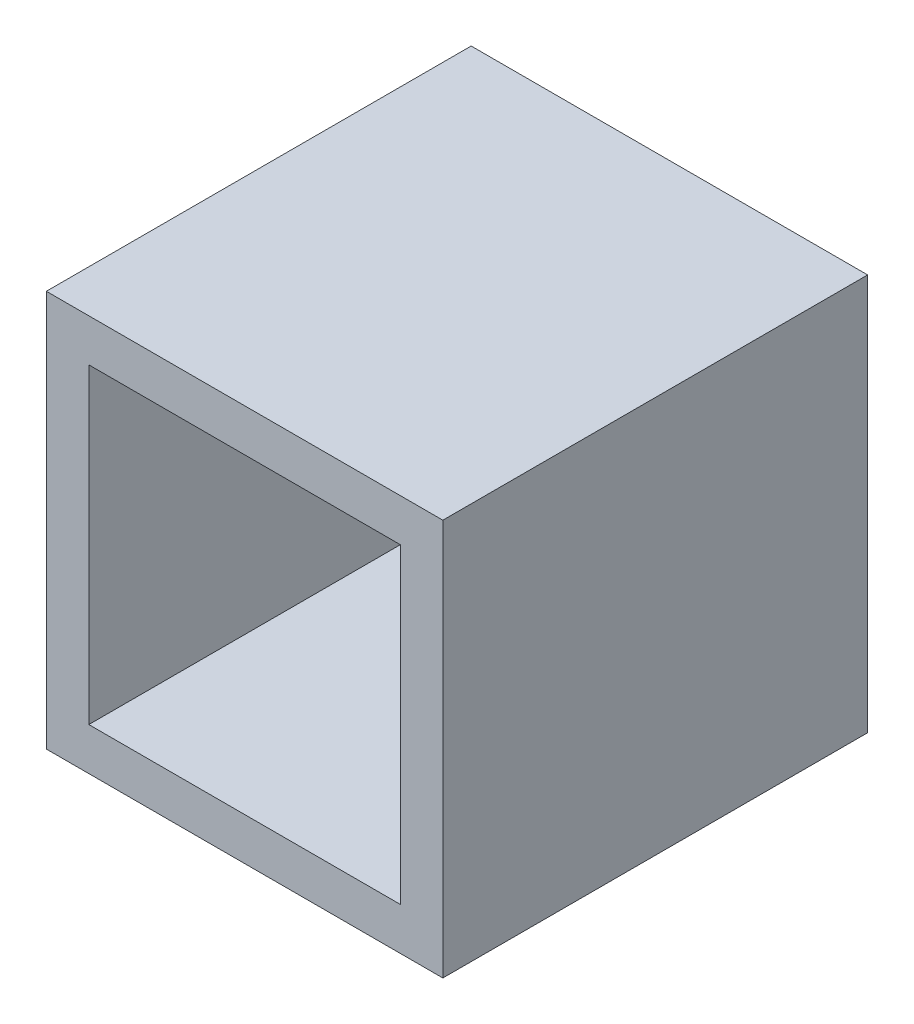
ISO-10303-21;
HEADER;
FILE_DESCRIPTION(('STEP AP214'),'2;1');
FILE_NAME('part.step','',(''),(''),'','','');
FILE_SCHEMA(('AUTOMOTIVE_DESIGN { 1 0 10303 214 1 1 1 1 }'));
ENDSEC;
DATA;
#1=APPLICATION_CONTEXT('core data for automotive mechanical design processes');
#2=APPLICATION_PROTOCOL_DEFINITION('international standard','automotive_design',2000,#1);
#3=PRODUCT_CONTEXT('',#1,'mechanical');
#4=PRODUCT('Part','Part','',(#3));
#5=PRODUCT_RELATED_PRODUCT_CATEGORY('part','',(#4));
#6=PRODUCT_DEFINITION_FORMATION('','',#4);
#7=PRODUCT_DEFINITION_CONTEXT('part definition',#1,'design');
#8=PRODUCT_DEFINITION('design','',#6,#7);
#9=PRODUCT_DEFINITION_SHAPE('','',#8);
#10=(LENGTH_UNIT() NAMED_UNIT(*) SI_UNIT(.MILLI.,.METRE.));
#11=(NAMED_UNIT(*) PLANE_ANGLE_UNIT() SI_UNIT($,.RADIAN.));
#12=(NAMED_UNIT(*) SI_UNIT($,.STERADIAN.) SOLID_ANGLE_UNIT());
#13=UNCERTAINTY_MEASURE_WITH_UNIT(LENGTH_MEASURE(1.E-05),#10,'distance_accuracy_value','');
#14=(GEOMETRIC_REPRESENTATION_CONTEXT(3) GLOBAL_UNCERTAINTY_ASSIGNED_CONTEXT((#13)) GLOBAL_UNIT_ASSIGNED_CONTEXT((#10,
#11,#12)) REPRESENTATION_CONTEXT('',''));
#15=CARTESIAN_POINT('',(0.,0.,0.));
#16=DIRECTION('',(0.,0.,1.));
#17=DIRECTION('',(1.,0.,0.));
#18=AXIS2_PLACEMENT_3D('',#15,#16,#17);
#19=CARTESIAN_POINT('',(0.,38.554945104537,-75.));
#20=DIRECTION('',(0.,1.,0.));
#21=DIRECTION('',(-1.,0.,0.));
#22=AXIS2_PLACEMENT_3D('',#19,#20,#21);
#23=PLANE('',#22);
#24=DIRECTION('',(-1.,0.,0.));
#25=VECTOR('',#24,1.);
#26=CARTESIAN_POINT('',(0.,38.554945104537,0.));
#27=LINE('',#26,#25);
#28=CARTESIAN_POINT('',(-32.6300365969751,38.554945104537,0.));
#29=VERTEX_POINT('',#28);
#30=CARTESIAN_POINT('',(-102.630036596975,38.5549451045369,0.));
#31=VERTEX_POINT('',#30);
#32=EDGE_CURVE('E161',#29,#31,#27,.T.);
#33=ORIENTED_EDGE('',*,*,#32,.F.);
#34=DIRECTION('',(0.,0.,1.));
#35=VECTOR('',#34,1.);
#36=CARTESIAN_POINT('',(-32.6300365969751,38.554945104537,-75.));
#37=LINE('',#36,#35);
#38=CARTESIAN_POINT('',(-32.6300365969751,38.554945104537,-75.));
#39=VERTEX_POINT('',#38);
#40=EDGE_CURVE('E11',#39,#29,#37,.T.);
#41=ORIENTED_EDGE('',*,*,#40,.F.);
#42=DIRECTION('',(-1.,0.,0.));
#43=VECTOR('',#42,1.);
#44=CARTESIAN_POINT('',(0.,38.554945104537,-75.));
#45=LINE('',#44,#43);
#46=CARTESIAN_POINT('',(-102.630036596975,38.5549451045369,-75.));
#47=VERTEX_POINT('',#46);
#48=EDGE_CURVE('E137',#39,#47,#45,.T.);
#49=ORIENTED_EDGE('',*,*,#48,.T.);
#50=DIRECTION('',(0.,0.,1.));
#51=VECTOR('',#50,1.);
#52=CARTESIAN_POINT('',(-102.630036596975,38.5549451045369,-75.));
#53=LINE('',#52,#51);
#54=EDGE_CURVE('E133',#47,#31,#53,.T.);
#55=ORIENTED_EDGE('',*,*,#54,.T.);
#56=EDGE_LOOP('',(#33,#41,#49,#55));
#57=FACE_BOUND('',#56,.T.);
#58=ADVANCED_FACE('F41',(#57),#23,.T.);
#59=CARTESIAN_POINT('',(-32.6300365969751,0.,-75.));
#60=DIRECTION('',(-1.,0.,0.));
#61=DIRECTION('',(0.,-1.,0.));
#62=AXIS2_PLACEMENT_3D('',#59,#60,#61);
#63=PLANE('',#62);
#64=DIRECTION('',(0.,-1.,0.));
#65=VECTOR('',#64,1.);
#66=CARTESIAN_POINT('',(-32.6300365969751,0.,0.));
#67=LINE('',#66,#65);
#68=CARTESIAN_POINT('',(-32.630036596975,-31.4450548954631,0.));
#69=VERTEX_POINT('',#68);
#70=EDGE_CURVE('E170',#29,#69,#67,.T.);
#71=ORIENTED_EDGE('',*,*,#70,.T.);
#72=DIRECTION('',(0.,0.,1.));
#73=VECTOR('',#72,1.);
#74=CARTESIAN_POINT('',(-32.630036596975,-31.4450548954631,-75.));
#75=LINE('',#74,#73);
#76=CARTESIAN_POINT('',(-32.630036596975,-31.4450548954631,-75.));
#77=VERTEX_POINT('',#76);
#78=EDGE_CURVE('E52',#77,#69,#75,.T.);
#79=ORIENTED_EDGE('',*,*,#78,.F.);
#80=DIRECTION('',(0.,-1.,0.));
#81=VECTOR('',#80,1.);
#82=CARTESIAN_POINT('',(-32.6300365969751,0.,-75.));
#83=LINE('',#82,#81);
#84=EDGE_CURVE('E123',#39,#77,#83,.T.);
#85=ORIENTED_EDGE('',*,*,#84,.F.);
#86=ORIENTED_EDGE('',*,*,#40,.T.);
#87=EDGE_LOOP('',(#71,#79,#85,#86));
#88=FACE_BOUND('',#87,.T.);
#89=ADVANCED_FACE('F220',(#88),#63,.F.);
#90=CARTESIAN_POINT('',(0.,-31.445054895463,-75.));
#91=DIRECTION('',(0.,1.,0.));
#92=DIRECTION('',(-1.,0.,0.));
#93=AXIS2_PLACEMENT_3D('',#90,#91,#92);
#94=PLANE('',#93);
#95=DIRECTION('',(-1.,0.,0.));
#96=VECTOR('',#95,1.);
#97=CARTESIAN_POINT('',(0.,-31.445054895463,0.));
#98=LINE('',#97,#96);
#99=CARTESIAN_POINT('',(-102.630036596975,-31.4450548954631,0.));
#100=VERTEX_POINT('',#99);
#101=EDGE_CURVE('E89',#69,#100,#98,.T.);
#102=ORIENTED_EDGE('',*,*,#101,.T.);
#103=DIRECTION('',(0.,0.,1.));
#104=VECTOR('',#103,1.);
#105=CARTESIAN_POINT('',(-102.630036596975,-31.4450548954631,-75.));
#106=LINE('',#105,#104);
#107=CARTESIAN_POINT('',(-102.630036596975,-31.4450548954631,-75.));
#108=VERTEX_POINT('',#107);
#109=EDGE_CURVE('E128',#108,#100,#106,.T.);
#110=ORIENTED_EDGE('',*,*,#109,.F.);
#111=DIRECTION('',(-1.,0.,0.));
#112=VECTOR('',#111,1.);
#113=CARTESIAN_POINT('',(0.,-31.445054895463,-75.));
#114=LINE('',#113,#112);
#115=EDGE_CURVE('E117',#77,#108,#114,.T.);
#116=ORIENTED_EDGE('',*,*,#115,.F.);
#117=ORIENTED_EDGE('',*,*,#78,.T.);
#118=EDGE_LOOP('',(#102,#110,#116,#117));
#119=FACE_BOUND('',#118,.T.);
#120=ADVANCED_FACE('F129',(#119),#94,.F.);
#121=CARTESIAN_POINT('',(-95.1300365969751,0.,-75.));
#122=DIRECTION('',(-1.,0.,0.));
#123=DIRECTION('',(0.,-1.,0.));
#124=AXIS2_PLACEMENT_3D('',#121,#122,#123);
#125=PLANE('',#124);
#126=DIRECTION('',(0.,-1.,0.));
#127=VECTOR('',#126,1.);
#128=CARTESIAN_POINT('',(-95.1300365969751,0.,0.));
#129=LINE('',#128,#127);
#130=CARTESIAN_POINT('',(-95.1300365969751,31.0549451045369,0.));
#131=VERTEX_POINT('',#130);
#132=CARTESIAN_POINT('',(-95.1300365969751,-23.9450548954631,0.));
#133=VERTEX_POINT('',#132);
#134=EDGE_CURVE('E146',#131,#133,#129,.T.);
#135=ORIENTED_EDGE('',*,*,#134,.T.);
#136=DIRECTION('',(0.,0.,1.));
#137=VECTOR('',#136,1.);
#138=CARTESIAN_POINT('',(-95.1300365969751,-23.9450548954631,-75.));
#139=LINE('',#138,#137);
#140=CARTESIAN_POINT('',(-95.1300365969751,-23.9450548954631,-75.));
#141=VERTEX_POINT('',#140);
#142=EDGE_CURVE('E178',#141,#133,#139,.T.);
#143=ORIENTED_EDGE('',*,*,#142,.F.);
#144=DIRECTION('',(0.,-1.,0.));
#145=VECTOR('',#144,1.);
#146=CARTESIAN_POINT('',(-95.1300365969751,0.,-75.));
#147=LINE('',#146,#145);
#148=CARTESIAN_POINT('',(-95.1300365969751,31.0549451045369,-75.));
#149=VERTEX_POINT('',#148);
#150=EDGE_CURVE('E172',#149,#141,#147,.T.);
#151=ORIENTED_EDGE('',*,*,#150,.F.);
#152=DIRECTION('',(0.,0.,1.));
#153=VECTOR('',#152,1.);
#154=CARTESIAN_POINT('',(-95.1300365969751,31.0549451045369,-75.));
#155=LINE('',#154,#153);
#156=EDGE_CURVE('E45',#149,#131,#155,.T.);
#157=ORIENTED_EDGE('',*,*,#156,.T.);
#158=EDGE_LOOP('',(#135,#143,#151,#157));
#159=FACE_BOUND('',#158,.T.);
#160=ADVANCED_FACE('F43',(#159),#125,.F.);
#161=CARTESIAN_POINT('',(0.,-23.945054895463,-75.));
#162=DIRECTION('',(0.,1.,0.));
#163=DIRECTION('',(-1.,0.,0.));
#164=AXIS2_PLACEMENT_3D('',#161,#162,#163);
#165=PLANE('',#164);
#166=DIRECTION('',(-1.,0.,0.));
#167=VECTOR('',#166,1.);
#168=CARTESIAN_POINT('',(0.,-23.945054895463,0.));
#169=LINE('',#168,#167);
#170=CARTESIAN_POINT('',(-40.1300365969751,-23.945054895463,0.));
#171=VERTEX_POINT('',#170);
#172=EDGE_CURVE('E157',#171,#133,#169,.T.);
#173=ORIENTED_EDGE('',*,*,#172,.F.);
#174=DIRECTION('',(0.,0.,1.));
#175=VECTOR('',#174,1.);
#176=CARTESIAN_POINT('',(-40.1300365969751,-23.945054895463,-75.));
#177=LINE('',#176,#175);
#178=CARTESIAN_POINT('',(-40.1300365969751,-23.945054895463,-75.));
#179=VERTEX_POINT('',#178);
#180=EDGE_CURVE('E181',#179,#171,#177,.T.);
#181=ORIENTED_EDGE('',*,*,#180,.F.);
#182=DIRECTION('',(-1.,0.,0.));
#183=VECTOR('',#182,1.);
#184=CARTESIAN_POINT('',(0.,-23.945054895463,-75.));
#185=LINE('',#184,#183);
#186=EDGE_CURVE('E140',#179,#141,#185,.T.);
#187=ORIENTED_EDGE('',*,*,#186,.T.);
#188=ORIENTED_EDGE('',*,*,#142,.T.);
#189=EDGE_LOOP('',(#173,#181,#187,#188));
#190=FACE_BOUND('',#189,.T.);
#191=ADVANCED_FACE('F198',(#190),#165,.T.);
#192=CARTESIAN_POINT('',(-40.1300365969751,0.,-75.));
#193=DIRECTION('',(-1.,0.,0.));
#194=DIRECTION('',(0.,-1.,0.));
#195=AXIS2_PLACEMENT_3D('',#192,#193,#194);
#196=PLANE('',#195);
#197=DIRECTION('',(0.,-1.,0.));
#198=VECTOR('',#197,1.);
#199=CARTESIAN_POINT('',(-40.1300365969751,0.,0.));
#200=LINE('',#199,#198);
#201=CARTESIAN_POINT('',(-40.1300365969751,31.054945104537,0.));
#202=VERTEX_POINT('',#201);
#203=EDGE_CURVE('E153',#202,#171,#200,.T.);
#204=ORIENTED_EDGE('',*,*,#203,.F.);
#205=DIRECTION('',(0.,0.,1.));
#206=VECTOR('',#205,1.);
#207=CARTESIAN_POINT('',(-40.1300365969751,31.054945104537,-75.));
#208=LINE('',#207,#206);
#209=CARTESIAN_POINT('',(-40.1300365969751,31.054945104537,-75.));
#210=VERTEX_POINT('',#209);
#211=EDGE_CURVE('E183',#210,#202,#208,.T.);
#212=ORIENTED_EDGE('',*,*,#211,.F.);
#213=DIRECTION('',(0.,-1.,0.));
#214=VECTOR('',#213,1.);
#215=CARTESIAN_POINT('',(-40.1300365969751,0.,-75.));
#216=LINE('',#215,#214);
#217=EDGE_CURVE('E203',#210,#179,#216,.T.);
#218=ORIENTED_EDGE('',*,*,#217,.T.);
#219=ORIENTED_EDGE('',*,*,#180,.T.);
#220=EDGE_LOOP('',(#204,#212,#218,#219));
#221=FACE_BOUND('',#220,.T.);
#222=ADVANCED_FACE('F230',(#221),#196,.T.);
#223=CARTESIAN_POINT('',(0.,31.054945104537,-75.));
#224=DIRECTION('',(0.,1.,0.));
#225=DIRECTION('',(-1.,0.,0.));
#226=AXIS2_PLACEMENT_3D('',#223,#224,#225);
#227=PLANE('',#226);
#228=DIRECTION('',(-1.,0.,0.));
#229=VECTOR('',#228,1.);
#230=CARTESIAN_POINT('',(0.,31.054945104537,0.));
#231=LINE('',#230,#229);
#232=EDGE_CURVE('E150',#202,#131,#231,.T.);
#233=ORIENTED_EDGE('',*,*,#232,.T.);
#234=ORIENTED_EDGE('',*,*,#156,.F.);
#235=DIRECTION('',(-1.,0.,0.));
#236=VECTOR('',#235,1.);
#237=CARTESIAN_POINT('',(0.,31.054945104537,-75.));
#238=LINE('',#237,#236);
#239=EDGE_CURVE('E101',#210,#149,#238,.T.);
#240=ORIENTED_EDGE('',*,*,#239,.F.);
#241=ORIENTED_EDGE('',*,*,#211,.T.);
#242=EDGE_LOOP('',(#233,#234,#240,#241));
#243=FACE_BOUND('',#242,.T.);
#244=ADVANCED_FACE('F217',(#243),#227,.F.);
#245=CARTESIAN_POINT('',(-102.630036596975,0.,-75.));
#246=DIRECTION('',(-1.,0.,0.));
#247=DIRECTION('',(0.,-1.,0.));
#248=AXIS2_PLACEMENT_3D('',#245,#246,#247);
#249=PLANE('',#248);
#250=DIRECTION('',(0.,-1.,0.));
#251=VECTOR('',#250,1.);
#252=CARTESIAN_POINT('',(-102.630036596975,0.,0.));
#253=LINE('',#252,#251);
#254=EDGE_CURVE('E165',#31,#100,#253,.T.);
#255=ORIENTED_EDGE('',*,*,#254,.F.);
#256=ORIENTED_EDGE('',*,*,#54,.F.);
#257=DIRECTION('',(0.,-1.,0.));
#258=VECTOR('',#257,1.);
#259=CARTESIAN_POINT('',(-102.630036596975,0.,-75.));
#260=LINE('',#259,#258);
#261=EDGE_CURVE('E122',#47,#108,#260,.T.);
#262=ORIENTED_EDGE('',*,*,#261,.T.);
#263=ORIENTED_EDGE('',*,*,#109,.T.);
#264=EDGE_LOOP('',(#255,#256,#262,#263));
#265=FACE_BOUND('',#264,.T.);
#266=ADVANCED_FACE('F135',(#265),#249,.T.);
#267=CARTESIAN_POINT('',(0.,0.,-75.));
#268=DIRECTION('',(0.,0.,1.));
#269=DIRECTION('',(1.,0.,0.));
#270=AXIS2_PLACEMENT_3D('',#267,#268,#269);
#271=PLANE('',#270);
#272=ORIENTED_EDGE('',*,*,#150,.T.);
#273=ORIENTED_EDGE('',*,*,#186,.F.);
#274=ORIENTED_EDGE('',*,*,#217,.F.);
#275=ORIENTED_EDGE('',*,*,#239,.T.);
#276=EDGE_LOOP('',(#272,#273,#274,#275));
#277=FACE_BOUND('',#276,.T.);
#278=ORIENTED_EDGE('',*,*,#48,.F.);
#279=ORIENTED_EDGE('',*,*,#84,.T.);
#280=ORIENTED_EDGE('',*,*,#115,.T.);
#281=ORIENTED_EDGE('',*,*,#261,.F.);
#282=EDGE_LOOP('',(#278,#279,#280,#281));
#283=FACE_BOUND('',#282,.T.);
#284=ADVANCED_FACE('F120',(#277,#283),#271,.F.);
#285=CARTESIAN_POINT('',(0.,0.,0.));
#286=DIRECTION('',(0.,0.,1.));
#287=DIRECTION('',(1.,0.,0.));
#288=AXIS2_PLACEMENT_3D('',#285,#286,#287);
#289=PLANE('',#288);
#290=ORIENTED_EDGE('',*,*,#134,.F.);
#291=ORIENTED_EDGE('',*,*,#232,.F.);
#292=ORIENTED_EDGE('',*,*,#203,.T.);
#293=ORIENTED_EDGE('',*,*,#172,.T.);
#294=EDGE_LOOP('',(#290,#291,#292,#293));
#295=FACE_BOUND('',#294,.T.);
#296=ORIENTED_EDGE('',*,*,#32,.T.);
#297=ORIENTED_EDGE('',*,*,#254,.T.);
#298=ORIENTED_EDGE('',*,*,#101,.F.);
#299=ORIENTED_EDGE('',*,*,#70,.F.);
#300=EDGE_LOOP('',(#296,#297,#298,#299));
#301=FACE_BOUND('',#300,.T.);
#302=ADVANCED_FACE('F194',(#295,#301),#289,.T.);
#303=CLOSED_SHELL('',(#58,#89,#120,#160,#191,#222,#244,#266,#284,#302));
#304=MANIFOLD_SOLID_BREP('B2',#303);
#305=ADVANCED_BREP_SHAPE_REPRESENTATION('',(#18,#304),#14);
#306=SHAPE_DEFINITION_REPRESENTATION(#9,#305);
ENDSEC;
END-ISO-10303-21;
